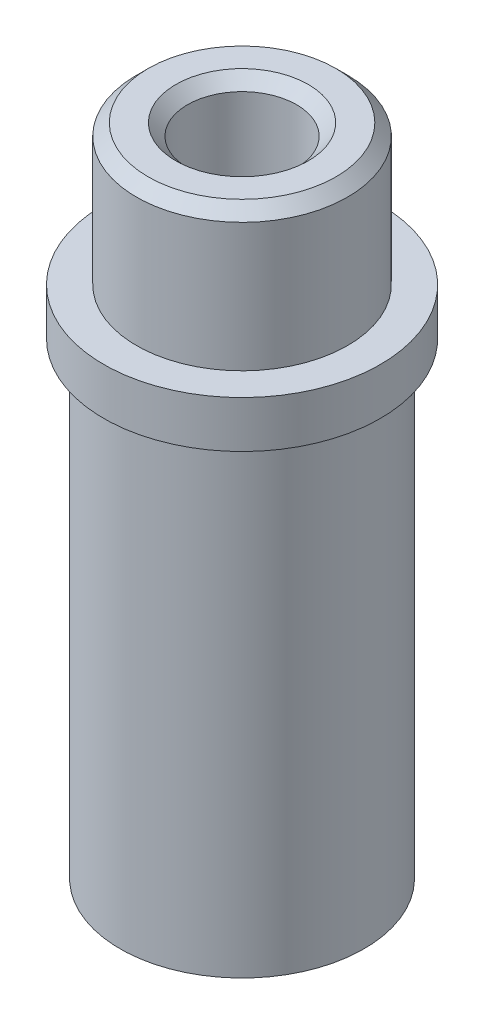
ISO-10303-21;
HEADER;
FILE_DESCRIPTION(('STEP AP214'),'2;1');
FILE_NAME('part.step','',(''),(''),'','','');
FILE_SCHEMA(('AUTOMOTIVE_DESIGN { 1 0 10303 214 1 1 1 1 }'));
ENDSEC;
DATA;
#1=APPLICATION_CONTEXT('core data for automotive mechanical design processes');
#2=APPLICATION_PROTOCOL_DEFINITION('international standard','automotive_design',2000,#1);
#3=PRODUCT_CONTEXT('',#1,'mechanical');
#4=PRODUCT('Part','Part','',(#3));
#5=PRODUCT_RELATED_PRODUCT_CATEGORY('part','',(#4));
#6=PRODUCT_DEFINITION_FORMATION('','',#4);
#7=PRODUCT_DEFINITION_CONTEXT('part definition',#1,'design');
#8=PRODUCT_DEFINITION('design','',#6,#7);
#9=PRODUCT_DEFINITION_SHAPE('','',#8);
#10=(LENGTH_UNIT() NAMED_UNIT(*) SI_UNIT(.MILLI.,.METRE.));
#11=(NAMED_UNIT(*) PLANE_ANGLE_UNIT() SI_UNIT($,.RADIAN.));
#12=(NAMED_UNIT(*) SI_UNIT($,.STERADIAN.) SOLID_ANGLE_UNIT());
#13=UNCERTAINTY_MEASURE_WITH_UNIT(LENGTH_MEASURE(1.E-05),#10,'distance_accuracy_value','');
#14=(GEOMETRIC_REPRESENTATION_CONTEXT(3) GLOBAL_UNCERTAINTY_ASSIGNED_CONTEXT((#13)) GLOBAL_UNIT_ASSIGNED_CONTEXT((#10,
#11,#12)) REPRESENTATION_CONTEXT('',''));
#15=CARTESIAN_POINT('',(0.,0.,0.));
#16=DIRECTION('',(0.,0.,1.));
#17=DIRECTION('',(1.,0.,0.));
#18=AXIS2_PLACEMENT_3D('',#15,#16,#17);
#19=CARTESIAN_POINT('',(0.,-11.1047181372549,0.));
#20=DIRECTION('',(0.,-1.,0.));
#21=DIRECTION('',(0.,0.,-1.));
#22=AXIS2_PLACEMENT_3D('',#19,#20,#21);
#23=CYLINDRICAL_SURFACE('',#22,1.778);
#24=CARTESIAN_POINT('',(0.,1.2142818627451,0.));
#25=DIRECTION('',(0.,-1.,0.));
#26=DIRECTION('',(0.,0.,-1.));
#27=AXIS2_PLACEMENT_3D('',#24,#25,#26);
#28=CIRCLE('',#27,1.778);
#29=CARTESIAN_POINT('',(0.,1.2142818627451,-1.778));
#30=VERTEX_POINT('',#29);
#31=EDGE_CURVE('E10',#30,#30,#28,.F.);
#32=ORIENTED_EDGE('',*,*,#31,.T.);
#33=EDGE_LOOP('',(#32));
#34=FACE_BOUND('',#33,.T.);
#35=CARTESIAN_POINT('',(0.,-11.1047181372549,0.));
#36=DIRECTION('',(0.,-1.,0.));
#37=DIRECTION('',(0.,0.,-1.));
#38=AXIS2_PLACEMENT_3D('',#35,#36,#37);
#39=CIRCLE('',#38,1.778);
#40=CARTESIAN_POINT('',(0.,-11.1047181372549,-1.778));
#41=VERTEX_POINT('',#40);
#42=EDGE_CURVE('E65',#41,#41,#39,.T.);
#43=ORIENTED_EDGE('',*,*,#42,.T.);
#44=EDGE_LOOP('',(#43));
#45=FACE_BOUND('',#44,.T.);
#46=ADVANCED_FACE('F30',(#34,#45),#23,.F.);
#47=CARTESIAN_POINT('',(-1.778,1.5952818627451,0.));
#48=DIRECTION('',(0.,-1.,0.));
#49=DIRECTION('',(0.,0.,-1.));
#50=AXIS2_PLACEMENT_3D('',#47,#48,#49);
#51=PLANE('',#50);
#52=CARTESIAN_POINT('',(0.,1.5952818627451,0.));
#53=DIRECTION('',(0.,-1.,0.));
#54=DIRECTION('',(0.,0.,-1.));
#55=AXIS2_PLACEMENT_3D('',#52,#53,#54);
#56=CIRCLE('',#55,3.0607);
#57=CARTESIAN_POINT('',(0.,1.5952818627451,-3.0607));
#58=VERTEX_POINT('',#57);
#59=EDGE_CURVE('E37',#58,#58,#56,.F.);
#60=ORIENTED_EDGE('',*,*,#59,.T.);
#61=EDGE_LOOP('',(#60));
#62=FACE_BOUND('',#61,.T.);
#63=CARTESIAN_POINT('',(0.,1.5952818627451,0.));
#64=DIRECTION('',(0.,-1.,0.));
#65=DIRECTION('',(0.,0.,-1.));
#66=AXIS2_PLACEMENT_3D('',#63,#64,#65);
#67=CIRCLE('',#66,2.159);
#68=CARTESIAN_POINT('',(0.,1.5952818627451,-2.159));
#69=VERTEX_POINT('',#68);
#70=EDGE_CURVE('E41',#69,#69,#67,.T.);
#71=ORIENTED_EDGE('',*,*,#70,.T.);
#72=EDGE_LOOP('',(#71));
#73=FACE_BOUND('',#72,.T.);
#74=ADVANCED_FACE('F84',(#62,#73),#51,.F.);
#75=CARTESIAN_POINT('',(0.,-11.1047181372549,0.));
#76=DIRECTION('',(0.,-1.,0.));
#77=DIRECTION('',(0.,0.,-1.));
#78=AXIS2_PLACEMENT_3D('',#75,#76,#77);
#79=CYLINDRICAL_SURFACE('',#78,3.4417);
#80=CARTESIAN_POINT('',(0.,1.2142818627451,0.));
#81=DIRECTION('',(0.,-1.,0.));
#82=DIRECTION('',(0.,0.,-1.));
#83=AXIS2_PLACEMENT_3D('',#80,#81,#82);
#84=CIRCLE('',#83,3.4417);
#85=CARTESIAN_POINT('',(0.,1.2142818627451,-3.4417));
#86=VERTEX_POINT('',#85);
#87=EDGE_CURVE('E45',#86,#86,#84,.T.);
#88=ORIENTED_EDGE('',*,*,#87,.T.);
#89=EDGE_LOOP('',(#88));
#90=FACE_BOUND('',#89,.T.);
#91=CARTESIAN_POINT('',(0.,-2.9767181372549,0.));
#92=DIRECTION('',(0.,-1.,0.));
#93=DIRECTION('',(0.,0.,-1.));
#94=AXIS2_PLACEMENT_3D('',#91,#92,#93);
#95=CIRCLE('',#94,3.4417);
#96=CARTESIAN_POINT('',(0.,-2.9767181372549,-3.4417));
#97=VERTEX_POINT('',#96);
#98=EDGE_CURVE('E50',#97,#97,#95,.T.);
#99=ORIENTED_EDGE('',*,*,#98,.F.);
#100=EDGE_LOOP('',(#99));
#101=FACE_BOUND('',#100,.T.);
#102=ADVANCED_FACE('F89',(#90,#101),#79,.T.);
#103=CARTESIAN_POINT('',(-3.4417,-2.9767181372549,0.));
#104=DIRECTION('',(0.,-1.,0.));
#105=DIRECTION('',(0.,0.,-1.));
#106=AXIS2_PLACEMENT_3D('',#103,#104,#105);
#107=PLANE('',#106);
#108=CARTESIAN_POINT('',(0.,-2.9767181372549,0.));
#109=DIRECTION('',(0.,-1.,0.));
#110=DIRECTION('',(0.,0.,-1.));
#111=AXIS2_PLACEMENT_3D('',#108,#109,#110);
#112=CIRCLE('',#111,4.5085);
#113=CARTESIAN_POINT('',(0.,-2.9767181372549,-4.5085));
#114=VERTEX_POINT('',#113);
#115=EDGE_CURVE('E53',#114,#114,#112,.T.);
#116=ORIENTED_EDGE('',*,*,#115,.F.);
#117=EDGE_LOOP('',(#116));
#118=FACE_BOUND('',#117,.T.);
#119=ORIENTED_EDGE('',*,*,#98,.T.);
#120=EDGE_LOOP('',(#119));
#121=FACE_BOUND('',#120,.T.);
#122=ADVANCED_FACE('F94',(#118,#121),#107,.F.);
#123=CARTESIAN_POINT('',(0.,-11.1047181372549,0.));
#124=DIRECTION('',(0.,-1.,0.));
#125=DIRECTION('',(0.,0.,-1.));
#126=AXIS2_PLACEMENT_3D('',#123,#124,#125);
#127=CYLINDRICAL_SURFACE('',#126,4.5085);
#128=CARTESIAN_POINT('',(0.,-4.5007181372549,0.));
#129=DIRECTION('',(0.,-1.,0.));
#130=DIRECTION('',(0.,0.,-1.));
#131=AXIS2_PLACEMENT_3D('',#128,#129,#130);
#132=CIRCLE('',#131,4.5085);
#133=CARTESIAN_POINT('',(0.,-4.5007181372549,-4.5085));
#134=VERTEX_POINT('',#133);
#135=EDGE_CURVE('E56',#134,#134,#132,.T.);
#136=ORIENTED_EDGE('',*,*,#135,.F.);
#137=EDGE_LOOP('',(#136));
#138=FACE_BOUND('',#137,.T.);
#139=ORIENTED_EDGE('',*,*,#115,.T.);
#140=EDGE_LOOP('',(#139));
#141=FACE_BOUND('',#140,.T.);
#142=ADVANCED_FACE('F98',(#138,#141),#127,.T.);
#143=CARTESIAN_POINT('',(-4.5085,-4.5007181372549,0.));
#144=DIRECTION('',(0.,1.,0.));
#145=DIRECTION('',(0.,0.,1.));
#146=AXIS2_PLACEMENT_3D('',#143,#144,#145);
#147=PLANE('',#146);
#148=CARTESIAN_POINT('',(0.,-4.5007181372549,0.));
#149=DIRECTION('',(0.,-1.,0.));
#150=DIRECTION('',(0.,0.,-1.));
#151=AXIS2_PLACEMENT_3D('',#148,#149,#150);
#152=CIRCLE('',#151,3.9751);
#153=CARTESIAN_POINT('',(0.,-4.5007181372549,-3.9751));
#154=VERTEX_POINT('',#153);
#155=EDGE_CURVE('E59',#154,#154,#152,.T.);
#156=ORIENTED_EDGE('',*,*,#155,.F.);
#157=EDGE_LOOP('',(#156));
#158=FACE_BOUND('',#157,.T.);
#159=ORIENTED_EDGE('',*,*,#135,.T.);
#160=EDGE_LOOP('',(#159));
#161=FACE_BOUND('',#160,.T.);
#162=ADVANCED_FACE('F102',(#158,#161),#147,.F.);
#163=CARTESIAN_POINT('',(0.,-11.1047181372549,0.));
#164=DIRECTION('',(0.,-1.,0.));
#165=DIRECTION('',(0.,0.,-1.));
#166=AXIS2_PLACEMENT_3D('',#163,#164,#165);
#167=CYLINDRICAL_SURFACE('',#166,3.9751);
#168=CARTESIAN_POINT('',(0.,-19.7407181372549,0.));
#169=DIRECTION('',(0.,-1.,0.));
#170=DIRECTION('',(0.,0.,-1.));
#171=AXIS2_PLACEMENT_3D('',#168,#169,#170);
#172=CIRCLE('',#171,3.9751);
#173=CARTESIAN_POINT('',(0.,-19.7407181372549,-3.9751));
#174=VERTEX_POINT('',#173);
#175=EDGE_CURVE('E62',#174,#174,#172,.T.);
#176=ORIENTED_EDGE('',*,*,#175,.F.);
#177=EDGE_LOOP('',(#176));
#178=FACE_BOUND('',#177,.T.);
#179=ORIENTED_EDGE('',*,*,#155,.T.);
#180=EDGE_LOOP('',(#179));
#181=FACE_BOUND('',#180,.T.);
#182=ADVANCED_FACE('F80',(#178,#181),#167,.T.);
#183=CARTESIAN_POINT('',(-3.9751,-19.7407181372549,0.));
#184=DIRECTION('',(0.,1.,0.));
#185=DIRECTION('',(0.,0.,1.));
#186=AXIS2_PLACEMENT_3D('',#183,#184,#185);
#187=PLANE('',#186);
#188=ORIENTED_EDGE('',*,*,#175,.T.);
#189=EDGE_LOOP('',(#188));
#190=FACE_BOUND('',#189,.T.);
#191=ADVANCED_FACE('F73',(#190),#187,.F.);
#192=CARTESIAN_POINT('',(0.,-11.1047181372549,0.));
#193=DIRECTION('',(0.,-1.,0.));
#194=DIRECTION('',(0.,0.,-1.));
#195=AXIS2_PLACEMENT_3D('',#192,#193,#194);
#196=PLANE('',#195);
#197=ORIENTED_EDGE('',*,*,#42,.F.);
#198=EDGE_LOOP('',(#197));
#199=FACE_BOUND('',#198,.T.);
#200=ADVANCED_FACE('F70',(#199),#196,.F.);
#201=CARTESIAN_POINT('',(0.,1.2142818627451,0.));
#202=DIRECTION('',(0.,-1.,0.));
#203=DIRECTION('',(0.,0.,-1.));
#204=AXIS2_PLACEMENT_3D('',#201,#202,#203);
#205=CONICAL_SURFACE('',#204,3.4417,0.785398163397447);
#206=ORIENTED_EDGE('',*,*,#59,.F.);
#207=EDGE_LOOP('',(#206));
#208=FACE_BOUND('',#207,.T.);
#209=ORIENTED_EDGE('',*,*,#87,.F.);
#210=EDGE_LOOP('',(#209));
#211=FACE_BOUND('',#210,.T.);
#212=ADVANCED_FACE('F72',(#208,#211),#205,.T.);
#213=CARTESIAN_POINT('',(0.,1.5952818627451,0.));
#214=DIRECTION('',(0.,1.,0.));
#215=DIRECTION('',(0.,0.,1.));
#216=AXIS2_PLACEMENT_3D('',#213,#214,#215);
#217=CONICAL_SURFACE('',#216,2.159,0.785398163397444);
#218=ORIENTED_EDGE('',*,*,#31,.F.);
#219=EDGE_LOOP('',(#218));
#220=FACE_BOUND('',#219,.T.);
#221=ORIENTED_EDGE('',*,*,#70,.F.);
#222=EDGE_LOOP('',(#221));
#223=FACE_BOUND('',#222,.T.);
#224=ADVANCED_FACE('F32',(#220,#223),#217,.F.);
#225=CLOSED_SHELL('',(#46,#74,#102,#122,#142,#162,#182,#191,#200,#212,#224));
#226=MANIFOLD_SOLID_BREP('B2',#225);
#227=ADVANCED_BREP_SHAPE_REPRESENTATION('',(#18,#226),#14);
#228=SHAPE_DEFINITION_REPRESENTATION(#9,#227);
ENDSEC;
END-ISO-10303-21;
